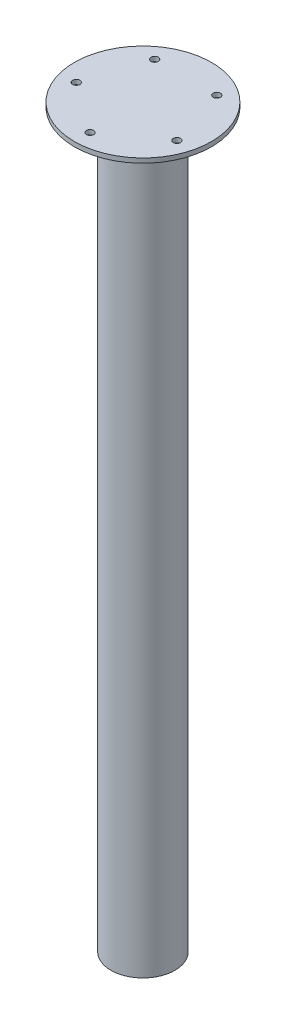
ISO-10303-21;
HEADER;
FILE_DESCRIPTION(('STEP AP214'),'2;1');
FILE_NAME('part.step','',(''),(''),'','','');
FILE_SCHEMA(('AUTOMOTIVE_DESIGN { 1 0 10303 214 1 1 1 1 }'));
ENDSEC;
DATA;
#1=APPLICATION_CONTEXT('core data for automotive mechanical design processes');
#2=APPLICATION_PROTOCOL_DEFINITION('international standard','automotive_design',2000,#1);
#3=PRODUCT_CONTEXT('',#1,'mechanical');
#4=PRODUCT('Part','Part','',(#3));
#5=PRODUCT_RELATED_PRODUCT_CATEGORY('part','',(#4));
#6=PRODUCT_DEFINITION_FORMATION('','',#4);
#7=PRODUCT_DEFINITION_CONTEXT('part definition',#1,'design');
#8=PRODUCT_DEFINITION('design','',#6,#7);
#9=PRODUCT_DEFINITION_SHAPE('','',#8);
#10=(LENGTH_UNIT() NAMED_UNIT(*) SI_UNIT(.MILLI.,.METRE.));
#11=(NAMED_UNIT(*) PLANE_ANGLE_UNIT() SI_UNIT($,.RADIAN.));
#12=(NAMED_UNIT(*) SI_UNIT($,.STERADIAN.) SOLID_ANGLE_UNIT());
#13=UNCERTAINTY_MEASURE_WITH_UNIT(LENGTH_MEASURE(1.E-05),#10,'distance_accuracy_value','');
#14=(GEOMETRIC_REPRESENTATION_CONTEXT(3) GLOBAL_UNCERTAINTY_ASSIGNED_CONTEXT((#13)) GLOBAL_UNIT_ASSIGNED_CONTEXT((#10,
#11,#12)) REPRESENTATION_CONTEXT('',''));
#15=CARTESIAN_POINT('',(0.,0.,0.));
#16=DIRECTION('',(0.,0.,1.));
#17=DIRECTION('',(1.,0.,0.));
#18=AXIS2_PLACEMENT_3D('',#15,#16,#17);
#19=CARTESIAN_POINT('',(0.,800.,0.));
#20=DIRECTION('',(0.,-1.,0.));
#21=DIRECTION('',(0.,0.,-1.));
#22=AXIS2_PLACEMENT_3D('',#19,#20,#21);
#23=CYLINDRICAL_SURFACE('',#22,35.);
#24=CARTESIAN_POINT('',(0.,790.,0.));
#25=DIRECTION('',(0.,1.,0.));
#26=DIRECTION('',(0.,0.,1.));
#27=AXIS2_PLACEMENT_3D('',#24,#25,#26);
#28=CIRCLE('',#27,35.);
#29=CARTESIAN_POINT('',(0.,790.,35.));
#30=VERTEX_POINT('',#29);
#31=EDGE_CURVE('E10',#30,#30,#28,.F.);
#32=ORIENTED_EDGE('',*,*,#31,.T.);
#33=EDGE_LOOP('',(#32));
#34=FACE_BOUND('',#33,.T.);
#35=CARTESIAN_POINT('',(0.,0.,0.));
#36=DIRECTION('',(0.,1.,0.));
#37=DIRECTION('',(0.,0.,1.));
#38=AXIS2_PLACEMENT_3D('',#35,#36,#37);
#39=CIRCLE('',#38,35.);
#40=CARTESIAN_POINT('',(0.,0.,35.));
#41=VERTEX_POINT('',#40);
#42=EDGE_CURVE('E42',#41,#41,#39,.T.);
#43=ORIENTED_EDGE('',*,*,#42,.T.);
#44=EDGE_LOOP('',(#43));
#45=FACE_BOUND('',#44,.T.);
#46=ADVANCED_FACE('F31',(#34,#45),#23,.T.);
#47=CARTESIAN_POINT('',(0.,0.,0.));
#48=DIRECTION('',(0.,1.,0.));
#49=DIRECTION('',(0.,0.,1.));
#50=AXIS2_PLACEMENT_3D('',#47,#48,#49);
#51=PLANE('',#50);
#52=ORIENTED_EDGE('',*,*,#42,.F.);
#53=EDGE_LOOP('',(#52));
#54=FACE_BOUND('',#53,.T.);
#55=ADVANCED_FACE('F116',(#54),#51,.F.);
#56=CARTESIAN_POINT('',(0.,800.,0.));
#57=DIRECTION('',(0.,1.,0.));
#58=DIRECTION('',(0.,0.,1.));
#59=AXIS2_PLACEMENT_3D('',#56,#57,#58);
#60=PLANE('',#59);
#61=CARTESIAN_POINT('',(-55.0262334673692,800.,17.8791070630593));
#62=DIRECTION('',(0.,1.,0.));
#63=DIRECTION('',(-0.95105651629515,0.,0.309016994374958));
#64=AXIS2_PLACEMENT_3D('',#61,#62,#63);
#65=CIRCLE('',#64,4.);
#66=CARTESIAN_POINT('',(-58.8304595325498,800.,19.1151750405591));
#67=VERTEX_POINT('',#66);
#68=EDGE_CURVE('E81',#67,#67,#65,.T.);
#69=ORIENTED_EDGE('',*,*,#68,.T.);
#70=EDGE_LOOP('',(#69));
#71=FACE_BOUND('',#70,.T.);
#72=CARTESIAN_POINT('',(-34.0080825557217,800.,-46.8081099795856));
#73=DIRECTION('',(0.,1.,0.));
#74=DIRECTION('',(-0.58778525229248,0.,-0.809016994374942));
#75=AXIS2_PLACEMENT_3D('',#72,#73,#74);
#76=CIRCLE('',#75,4.);
#77=CARTESIAN_POINT('',(-36.3592235648916,800.,-50.0441779570854));
#78=VERTEX_POINT('',#77);
#79=EDGE_CURVE('E75',#78,#78,#76,.T.);
#80=ORIENTED_EDGE('',*,*,#79,.T.);
#81=EDGE_LOOP('',(#80));
#82=FACE_BOUND('',#81,.T.);
#83=CARTESIAN_POINT('',(34.008082555721,800.,-46.8081099795861));
#84=DIRECTION('',(0.,1.,0.));
#85=DIRECTION('',(0.587785252292469,0.,-0.809016994374951));
#86=AXIS2_PLACEMENT_3D('',#83,#84,#85);
#87=CIRCLE('',#86,4.);
#88=CARTESIAN_POINT('',(36.3592235648909,800.,-50.0441779570859));
#89=VERTEX_POINT('',#88);
#90=EDGE_CURVE('E69',#89,#89,#87,.T.);
#91=ORIENTED_EDGE('',*,*,#90,.T.);
#92=EDGE_LOOP('',(#91));
#93=FACE_BOUND('',#92,.T.);
#94=CARTESIAN_POINT('',(55.0262334673695,800.,17.8791070630585));
#95=DIRECTION('',(0.,1.,0.));
#96=DIRECTION('',(0.951056516295155,0.,0.309016994374945));
#97=AXIS2_PLACEMENT_3D('',#94,#95,#96);
#98=CIRCLE('',#97,4.);
#99=CARTESIAN_POINT('',(58.8304595325501,800.,19.1151750405583));
#100=VERTEX_POINT('',#99);
#101=EDGE_CURVE('E63',#100,#100,#98,.T.);
#102=ORIENTED_EDGE('',*,*,#101,.T.);
#103=EDGE_LOOP('',(#102));
#104=FACE_BOUND('',#103,.T.);
#105=CARTESIAN_POINT('',(0.,800.,57.8580058330544));
#106=DIRECTION('',(0.,1.,0.));
#107=DIRECTION('',(0.,0.,1.));
#108=AXIS2_PLACEMENT_3D('',#105,#106,#107);
#109=CIRCLE('',#108,4.);
#110=CARTESIAN_POINT('',(0.,800.,61.8580058330544));
#111=VERTEX_POINT('',#110);
#112=EDGE_CURVE('E52',#111,#111,#109,.T.);
#113=ORIENTED_EDGE('',*,*,#112,.T.);
#114=EDGE_LOOP('',(#113));
#115=FACE_BOUND('',#114,.T.);
#116=CARTESIAN_POINT('',(0.,800.,0.));
#117=DIRECTION('',(0.,1.,0.));
#118=DIRECTION('',(0.,0.,1.));
#119=AXIS2_PLACEMENT_3D('',#116,#117,#118);
#120=CIRCLE('',#119,45.);
#121=CARTESIAN_POINT('',(0.,800.,45.));
#122=VERTEX_POINT('',#121);
#123=EDGE_CURVE('E38',#122,#122,#120,.T.);
#124=ORIENTED_EDGE('',*,*,#123,.T.);
#125=EDGE_LOOP('',(#124));
#126=FACE_BOUND('',#125,.T.);
#127=CARTESIAN_POINT('',(0.,800.,0.));
#128=DIRECTION('',(0.,1.,0.));
#129=DIRECTION('',(0.,0.,1.));
#130=AXIS2_PLACEMENT_3D('',#127,#128,#129);
#131=CIRCLE('',#130,75.);
#132=CARTESIAN_POINT('',(0.,800.,75.));
#133=VERTEX_POINT('',#132);
#134=EDGE_CURVE('E49',#133,#133,#131,.T.);
#135=ORIENTED_EDGE('',*,*,#134,.F.);
#136=EDGE_LOOP('',(#135));
#137=FACE_BOUND('',#136,.T.);
#138=ADVANCED_FACE('F85',(#71,#82,#93,#104,#115,#126,#137),#60,.F.);
#139=CARTESIAN_POINT('',(0.,805.,0.));
#140=DIRECTION('',(0.,-1.,0.));
#141=DIRECTION('',(0.,0.,-1.));
#142=AXIS2_PLACEMENT_3D('',#139,#140,#141);
#143=CYLINDRICAL_SURFACE('',#142,75.);
#144=CARTESIAN_POINT('',(0.,805.,0.));
#145=DIRECTION('',(0.,1.,0.));
#146=DIRECTION('',(0.,0.,1.));
#147=AXIS2_PLACEMENT_3D('',#144,#145,#146);
#148=CIRCLE('',#147,75.);
#149=CARTESIAN_POINT('',(0.,805.,75.));
#150=VERTEX_POINT('',#149);
#151=EDGE_CURVE('E46',#150,#150,#148,.T.);
#152=ORIENTED_EDGE('',*,*,#151,.F.);
#153=EDGE_LOOP('',(#152));
#154=FACE_BOUND('',#153,.T.);
#155=ORIENTED_EDGE('',*,*,#134,.T.);
#156=EDGE_LOOP('',(#155));
#157=FACE_BOUND('',#156,.T.);
#158=ADVANCED_FACE('F98',(#154,#157),#143,.T.);
#159=CARTESIAN_POINT('',(0.,805.,0.));
#160=DIRECTION('',(0.,1.,0.));
#161=DIRECTION('',(0.,0.,1.));
#162=AXIS2_PLACEMENT_3D('',#159,#160,#161);
#163=PLANE('',#162);
#164=CARTESIAN_POINT('',(-55.0262334673692,805.,17.8791070630593));
#165=DIRECTION('',(0.,1.,0.));
#166=DIRECTION('',(-0.95105651629515,0.,0.309016994374958));
#167=AXIS2_PLACEMENT_3D('',#164,#165,#166);
#168=CIRCLE('',#167,4.);
#169=CARTESIAN_POINT('',(-58.8304595325498,805.,19.1151750405591));
#170=VERTEX_POINT('',#169);
#171=EDGE_CURVE('E78',#170,#170,#168,.T.);
#172=ORIENTED_EDGE('',*,*,#171,.F.);
#173=EDGE_LOOP('',(#172));
#174=FACE_BOUND('',#173,.T.);
#175=CARTESIAN_POINT('',(-34.0080825557217,805.,-46.8081099795856));
#176=DIRECTION('',(0.,1.,0.));
#177=DIRECTION('',(-0.58778525229248,0.,-0.809016994374942));
#178=AXIS2_PLACEMENT_3D('',#175,#176,#177);
#179=CIRCLE('',#178,4.);
#180=CARTESIAN_POINT('',(-36.3592235648916,805.,-50.0441779570854));
#181=VERTEX_POINT('',#180);
#182=EDGE_CURVE('E72',#181,#181,#179,.T.);
#183=ORIENTED_EDGE('',*,*,#182,.F.);
#184=EDGE_LOOP('',(#183));
#185=FACE_BOUND('',#184,.T.);
#186=CARTESIAN_POINT('',(34.008082555721,805.,-46.8081099795861));
#187=DIRECTION('',(0.,1.,0.));
#188=DIRECTION('',(0.587785252292469,0.,-0.809016994374951));
#189=AXIS2_PLACEMENT_3D('',#186,#187,#188);
#190=CIRCLE('',#189,4.);
#191=CARTESIAN_POINT('',(36.3592235648909,805.,-50.0441779570859));
#192=VERTEX_POINT('',#191);
#193=EDGE_CURVE('E66',#192,#192,#190,.T.);
#194=ORIENTED_EDGE('',*,*,#193,.F.);
#195=EDGE_LOOP('',(#194));
#196=FACE_BOUND('',#195,.T.);
#197=CARTESIAN_POINT('',(55.0262334673695,805.,17.8791070630585));
#198=DIRECTION('',(0.,1.,0.));
#199=DIRECTION('',(0.951056516295155,0.,0.309016994374945));
#200=AXIS2_PLACEMENT_3D('',#197,#198,#199);
#201=CIRCLE('',#200,4.);
#202=CARTESIAN_POINT('',(58.8304595325501,805.,19.1151750405583));
#203=VERTEX_POINT('',#202);
#204=EDGE_CURVE('E60',#203,#203,#201,.T.);
#205=ORIENTED_EDGE('',*,*,#204,.F.);
#206=EDGE_LOOP('',(#205));
#207=FACE_BOUND('',#206,.T.);
#208=CARTESIAN_POINT('',(0.,805.,57.8580058330544));
#209=DIRECTION('',(0.,1.,0.));
#210=DIRECTION('',(0.,0.,1.));
#211=AXIS2_PLACEMENT_3D('',#208,#209,#210);
#212=CIRCLE('',#211,4.);
#213=CARTESIAN_POINT('',(0.,805.,61.8580058330544));
#214=VERTEX_POINT('',#213);
#215=EDGE_CURVE('E57',#214,#214,#212,.T.);
#216=ORIENTED_EDGE('',*,*,#215,.F.);
#217=EDGE_LOOP('',(#216));
#218=FACE_BOUND('',#217,.T.);
#219=ORIENTED_EDGE('',*,*,#151,.T.);
#220=EDGE_LOOP('',(#219));
#221=FACE_BOUND('',#220,.T.);
#222=ADVANCED_FACE('F95',(#174,#185,#196,#207,#218,#221),#163,.T.);
#223=CARTESIAN_POINT('',(0.,790.,0.));
#224=DIRECTION('',(0.,1.,0.));
#225=DIRECTION('',(0.,0.,1.));
#226=AXIS2_PLACEMENT_3D('',#223,#224,#225);
#227=TOROIDAL_SURFACE('',#226,45.,10.);
#228=ORIENTED_EDGE('',*,*,#31,.F.);
#229=EDGE_LOOP('',(#228));
#230=FACE_BOUND('',#229,.T.);
#231=ORIENTED_EDGE('',*,*,#123,.F.);
#232=EDGE_LOOP('',(#231));
#233=FACE_BOUND('',#232,.T.);
#234=ADVANCED_FACE('F33',(#230,#233),#227,.F.);
#235=CARTESIAN_POINT('',(0.,805.,57.8580058330544));
#236=DIRECTION('',(0.,1.,0.));
#237=DIRECTION('',(0.,0.,1.));
#238=AXIS2_PLACEMENT_3D('',#235,#236,#237);
#239=CYLINDRICAL_SURFACE('',#238,4.);
#240=ORIENTED_EDGE('',*,*,#112,.F.);
#241=EDGE_LOOP('',(#240));
#242=FACE_BOUND('',#241,.T.);
#243=ORIENTED_EDGE('',*,*,#215,.T.);
#244=EDGE_LOOP('',(#243));
#245=FACE_BOUND('',#244,.T.);
#246=ADVANCED_FACE('F152',(#242,#245),#239,.F.);
#247=CARTESIAN_POINT('',(55.0262334673695,805.,17.8791070630585));
#248=DIRECTION('',(0.,1.,0.));
#249=DIRECTION('',(0.951056516295155,0.,0.309016994374945));
#250=AXIS2_PLACEMENT_3D('',#247,#248,#249);
#251=CYLINDRICAL_SURFACE('',#250,4.);
#252=ORIENTED_EDGE('',*,*,#101,.F.);
#253=EDGE_LOOP('',(#252));
#254=FACE_BOUND('',#253,.T.);
#255=ORIENTED_EDGE('',*,*,#204,.T.);
#256=EDGE_LOOP('',(#255));
#257=FACE_BOUND('',#256,.T.);
#258=ADVANCED_FACE('F159',(#254,#257),#251,.F.);
#259=CARTESIAN_POINT('',(34.008082555721,805.,-46.8081099795861));
#260=DIRECTION('',(0.,1.,0.));
#261=DIRECTION('',(0.587785252292469,0.,-0.809016994374951));
#262=AXIS2_PLACEMENT_3D('',#259,#260,#261);
#263=CYLINDRICAL_SURFACE('',#262,4.);
#264=ORIENTED_EDGE('',*,*,#90,.F.);
#265=EDGE_LOOP('',(#264));
#266=FACE_BOUND('',#265,.T.);
#267=ORIENTED_EDGE('',*,*,#193,.T.);
#268=EDGE_LOOP('',(#267));
#269=FACE_BOUND('',#268,.T.);
#270=ADVANCED_FACE('F166',(#266,#269),#263,.F.);
#271=CARTESIAN_POINT('',(-34.0080825557217,805.,-46.8081099795856));
#272=DIRECTION('',(0.,1.,0.));
#273=DIRECTION('',(-0.58778525229248,0.,-0.809016994374942));
#274=AXIS2_PLACEMENT_3D('',#271,#272,#273);
#275=CYLINDRICAL_SURFACE('',#274,4.);
#276=ORIENTED_EDGE('',*,*,#79,.F.);
#277=EDGE_LOOP('',(#276));
#278=FACE_BOUND('',#277,.T.);
#279=ORIENTED_EDGE('',*,*,#182,.T.);
#280=EDGE_LOOP('',(#279));
#281=FACE_BOUND('',#280,.T.);
#282=ADVANCED_FACE('F91',(#278,#281),#275,.F.);
#283=CARTESIAN_POINT('',(-55.0262334673692,805.,17.8791070630593));
#284=DIRECTION('',(0.,1.,0.));
#285=DIRECTION('',(-0.95105651629515,0.,0.309016994374958));
#286=AXIS2_PLACEMENT_3D('',#283,#284,#285);
#287=CYLINDRICAL_SURFACE('',#286,4.);
#288=ORIENTED_EDGE('',*,*,#68,.F.);
#289=EDGE_LOOP('',(#288));
#290=FACE_BOUND('',#289,.T.);
#291=ORIENTED_EDGE('',*,*,#171,.T.);
#292=EDGE_LOOP('',(#291));
#293=FACE_BOUND('',#292,.T.);
#294=ADVANCED_FACE('F88',(#290,#293),#287,.F.);
#295=CLOSED_SHELL('',(#46,#55,#138,#158,#222,#234,#246,#258,#270,#282,#294));
#296=MANIFOLD_SOLID_BREP('B2',#295);
#297=ADVANCED_BREP_SHAPE_REPRESENTATION('',(#18,#296),#14);
#298=SHAPE_DEFINITION_REPRESENTATION(#9,#297);
ENDSEC;
END-ISO-10303-21;
